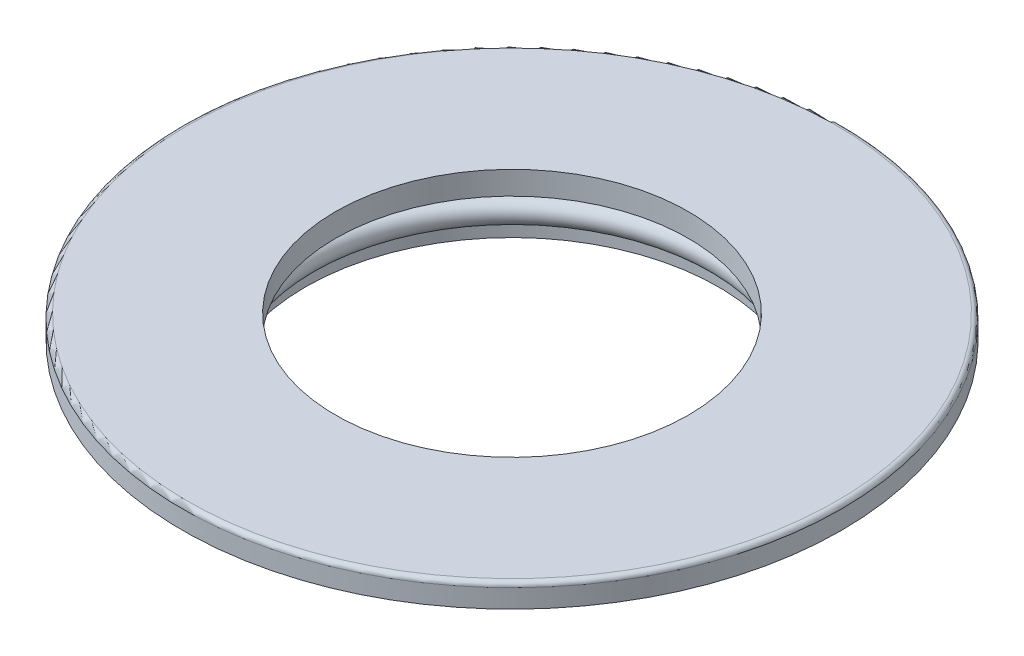
ISO-10303-21;
HEADER;
FILE_DESCRIPTION(('STEP AP214'),'2;1');
FILE_NAME('part.step','',(''),(''),'','','');
FILE_SCHEMA(('AUTOMOTIVE_DESIGN { 1 0 10303 214 1 1 1 1 }'));
ENDSEC;
DATA;
#1=APPLICATION_CONTEXT('core data for automotive mechanical design processes');
#2=APPLICATION_PROTOCOL_DEFINITION('international standard','automotive_design',2000,#1);
#3=PRODUCT_CONTEXT('',#1,'mechanical');
#4=PRODUCT('Part','Part','',(#3));
#5=PRODUCT_RELATED_PRODUCT_CATEGORY('part','',(#4));
#6=PRODUCT_DEFINITION_FORMATION('','',#4);
#7=PRODUCT_DEFINITION_CONTEXT('part definition',#1,'design');
#8=PRODUCT_DEFINITION('design','',#6,#7);
#9=PRODUCT_DEFINITION_SHAPE('','',#8);
#10=(LENGTH_UNIT() NAMED_UNIT(*) SI_UNIT(.MILLI.,.METRE.));
#11=(NAMED_UNIT(*) PLANE_ANGLE_UNIT() SI_UNIT($,.RADIAN.));
#12=(NAMED_UNIT(*) SI_UNIT($,.STERADIAN.) SOLID_ANGLE_UNIT());
#13=UNCERTAINTY_MEASURE_WITH_UNIT(LENGTH_MEASURE(1.E-05),#10,'distance_accuracy_value','');
#14=(GEOMETRIC_REPRESENTATION_CONTEXT(3) GLOBAL_UNCERTAINTY_ASSIGNED_CONTEXT((#13)) GLOBAL_UNIT_ASSIGNED_CONTEXT((#10,
#11,#12)) REPRESENTATION_CONTEXT('',''));
#15=CARTESIAN_POINT('',(0.,0.,0.));
#16=DIRECTION('',(0.,0.,1.));
#17=DIRECTION('',(1.,0.,0.));
#18=AXIS2_PLACEMENT_3D('',#15,#16,#17);
#19=CARTESIAN_POINT('',(97.4283139901652,39.892585804236,0.));
#20=DIRECTION('',(0.,1.,0.));
#21=DIRECTION('',(-1.,0.,0.));
#22=AXIS2_PLACEMENT_3D('',#19,#20,#21);
#23=CYLINDRICAL_SURFACE('',#22,38.);
#24=CARTESIAN_POINT('',(97.4283139901652,17.3301270189222,0.));
#25=DIRECTION('',(0.,1.,0.));
#26=DIRECTION('',(-1.,0.,0.));
#27=AXIS2_PLACEMENT_3D('',#24,#25,#26);
#28=CIRCLE('',#27,38.);
#29=CARTESIAN_POINT('',(59.4283139901652,17.3301270189222,0.));
#30=VERTEX_POINT('',#29);
#31=EDGE_CURVE('E74',#30,#30,#28,.T.);
#32=ORIENTED_EDGE('',*,*,#31,.T.);
#33=EDGE_LOOP('',(#32));
#34=FACE_BOUND('',#33,.T.);
#35=CARTESIAN_POINT('',(97.4283139901652,12.3301270189222,0.));
#36=DIRECTION('',(0.,1.,0.));
#37=DIRECTION('',(-1.,0.,0.));
#38=AXIS2_PLACEMENT_3D('',#35,#36,#37);
#39=CIRCLE('',#38,38.);
#40=CARTESIAN_POINT('',(59.4283139901652,12.3301270189222,0.));
#41=VERTEX_POINT('',#40);
#42=EDGE_CURVE('E10',#41,#41,#39,.T.);
#43=ORIENTED_EDGE('',*,*,#42,.F.);
#44=EDGE_LOOP('',(#43));
#45=FACE_BOUND('',#44,.T.);
#46=ADVANCED_FACE('F31',(#34,#45),#23,.F.);
#47=CARTESIAN_POINT('',(59.4283139901652,12.3301270189222,0.));
#48=DIRECTION('',(0.,-1.,0.));
#49=DIRECTION('',(1.,0.,0.));
#50=AXIS2_PLACEMENT_3D('',#47,#48,#49);
#51=PLANE('',#50);
#52=ORIENTED_EDGE('',*,*,#42,.T.);
#53=EDGE_LOOP('',(#52));
#54=FACE_BOUND('',#53,.T.);
#55=CARTESIAN_POINT('',(97.4283139901652,12.3301270189222,0.));
#56=DIRECTION('',(0.,1.,0.));
#57=DIRECTION('',(-1.,0.,0.));
#58=AXIS2_PLACEMENT_3D('',#55,#56,#57);
#59=CIRCLE('',#58,42.);
#60=CARTESIAN_POINT('',(55.4283139901652,12.3301270189222,0.));
#61=VERTEX_POINT('',#60);
#62=EDGE_CURVE('E37',#61,#61,#59,.T.);
#63=ORIENTED_EDGE('',*,*,#62,.F.);
#64=EDGE_LOOP('',(#63));
#65=FACE_BOUND('',#64,.T.);
#66=ADVANCED_FACE('F92',(#54,#65),#51,.T.);
#67=CARTESIAN_POINT('',(97.4283139901652,9.83012701892221,0.));
#68=DIRECTION('',(0.,1.,0.));
#69=DIRECTION('',(-1.,0.,0.));
#70=AXIS2_PLACEMENT_3D('',#67,#68,#69);
#71=TOROIDAL_SURFACE('',#70,42.,2.49999999999996);
#72=ORIENTED_EDGE('',*,*,#62,.T.);
#73=EDGE_LOOP('',(#72));
#74=FACE_BOUND('',#73,.T.);
#75=CARTESIAN_POINT('',(97.4283139901652,9.83012701892223,0.));
#76=DIRECTION('',(0.,1.,0.));
#77=DIRECTION('',(-1.,0.,0.));
#78=AXIS2_PLACEMENT_3D('',#75,#76,#77);
#79=CIRCLE('',#78,44.4999999999999);
#80=CARTESIAN_POINT('',(52.9283139901653,9.83012701892222,0.));
#81=VERTEX_POINT('',#80);
#82=EDGE_CURVE('E41',#81,#81,#79,.T.);
#83=ORIENTED_EDGE('',*,*,#82,.F.);
#84=EDGE_LOOP('',(#83));
#85=FACE_BOUND('',#84,.T.);
#86=ADVANCED_FACE('F96',(#74,#85),#71,.F.);
#87=CARTESIAN_POINT('',(97.4283139901652,39.892585804236,0.));
#88=DIRECTION('',(0.,1.,0.));
#89=DIRECTION('',(-1.,0.,0.));
#90=AXIS2_PLACEMENT_3D('',#87,#88,#89);
#91=CYLINDRICAL_SURFACE('',#90,44.4999999999999);
#92=ORIENTED_EDGE('',*,*,#82,.T.);
#93=EDGE_LOOP('',(#92));
#94=FACE_BOUND('',#93,.T.);
#95=CARTESIAN_POINT('',(97.4283139901652,8.00000000000004,0.));
#96=DIRECTION('',(0.,1.,0.));
#97=DIRECTION('',(-1.,0.,0.));
#98=AXIS2_PLACEMENT_3D('',#95,#96,#97);
#99=CIRCLE('',#98,44.4999999999999);
#100=CARTESIAN_POINT('',(52.9283139901653,8.00000000000002,0.));
#101=VERTEX_POINT('',#100);
#102=EDGE_CURVE('E45',#101,#101,#99,.T.);
#103=ORIENTED_EDGE('',*,*,#102,.F.);
#104=EDGE_LOOP('',(#103));
#105=FACE_BOUND('',#104,.T.);
#106=ADVANCED_FACE('F100',(#94,#105),#91,.F.);
#107=CARTESIAN_POINT('',(97.4283139901652,5.50000000000002,0.));
#108=DIRECTION('',(0.,1.,0.));
#109=DIRECTION('',(-1.,0.,0.));
#110=AXIS2_PLACEMENT_3D('',#107,#108,#109);
#111=TOROIDAL_SURFACE('',#110,44.5,2.50000000000002);
#112=ORIENTED_EDGE('',*,*,#102,.T.);
#113=EDGE_LOOP('',(#112));
#114=FACE_BOUND('',#113,.T.);
#115=CARTESIAN_POINT('',(97.4283139901652,3.,0.));
#116=DIRECTION('',(0.,1.,0.));
#117=DIRECTION('',(-1.,0.,0.));
#118=AXIS2_PLACEMENT_3D('',#115,#116,#117);
#119=CIRCLE('',#118,44.5);
#120=CARTESIAN_POINT('',(52.9283139901652,2.99999999999998,0.));
#121=VERTEX_POINT('',#120);
#122=EDGE_CURVE('E50',#121,#121,#119,.T.);
#123=ORIENTED_EDGE('',*,*,#122,.F.);
#124=EDGE_LOOP('',(#123));
#125=FACE_BOUND('',#124,.T.);
#126=ADVANCED_FACE('F106',(#114,#125),#111,.T.);
#127=CARTESIAN_POINT('',(97.4283139901652,39.892585804236,0.));
#128=DIRECTION('',(0.,1.,0.));
#129=DIRECTION('',(-1.,0.,0.));
#130=AXIS2_PLACEMENT_3D('',#127,#128,#129);
#131=CYLINDRICAL_SURFACE('',#130,44.5);
#132=ORIENTED_EDGE('',*,*,#122,.T.);
#133=EDGE_LOOP('',(#132));
#134=FACE_BOUND('',#133,.T.);
#135=CARTESIAN_POINT('',(97.4283139901652,0.,0.));
#136=DIRECTION('',(0.,1.,0.));
#137=DIRECTION('',(-1.,0.,0.));
#138=AXIS2_PLACEMENT_3D('',#135,#136,#137);
#139=CIRCLE('',#138,44.5);
#140=CARTESIAN_POINT('',(52.9283139901652,0.,0.));
#141=VERTEX_POINT('',#140);
#142=EDGE_CURVE('E53',#141,#141,#139,.T.);
#143=ORIENTED_EDGE('',*,*,#142,.F.);
#144=EDGE_LOOP('',(#143));
#145=FACE_BOUND('',#144,.T.);
#146=ADVANCED_FACE('F110',(#134,#145),#131,.F.);
#147=CARTESIAN_POINT('',(47.9283139901651,0.,0.));
#148=DIRECTION('',(0.,-1.,0.));
#149=DIRECTION('',(1.,0.,0.));
#150=AXIS2_PLACEMENT_3D('',#147,#148,#149);
#151=PLANE('',#150);
#152=ORIENTED_EDGE('',*,*,#142,.T.);
#153=EDGE_LOOP('',(#152));
#154=FACE_BOUND('',#153,.T.);
#155=CARTESIAN_POINT('',(97.4283139901652,0.,0.));
#156=DIRECTION('',(0.,1.,0.));
#157=DIRECTION('',(-1.,0.,0.));
#158=AXIS2_PLACEMENT_3D('',#155,#156,#157);
#159=CIRCLE('',#158,49.5000000000001);
#160=CARTESIAN_POINT('',(47.9283139901651,0.,0.));
#161=VERTEX_POINT('',#160);
#162=EDGE_CURVE('E56',#161,#161,#159,.T.);
#163=ORIENTED_EDGE('',*,*,#162,.F.);
#164=EDGE_LOOP('',(#163));
#165=FACE_BOUND('',#164,.T.);
#166=ADVANCED_FACE('F114',(#154,#165),#151,.T.);
#167=CARTESIAN_POINT('',(97.4283139901652,39.892585804236,0.));
#168=DIRECTION('',(0.,1.,0.));
#169=DIRECTION('',(-1.,0.,0.));
#170=AXIS2_PLACEMENT_3D('',#167,#168,#169);
#171=CYLINDRICAL_SURFACE('',#170,49.5000000000001);
#172=ORIENTED_EDGE('',*,*,#162,.T.);
#173=EDGE_LOOP('',(#172));
#174=FACE_BOUND('',#173,.T.);
#175=CARTESIAN_POINT('',(97.4283139901652,7.33012701892219,0.));
#176=DIRECTION('',(0.,1.,0.));
#177=DIRECTION('',(-1.,0.,0.));
#178=AXIS2_PLACEMENT_3D('',#175,#176,#177);
#179=CIRCLE('',#178,49.5000000000001);
#180=CARTESIAN_POINT('',(47.9283139901651,7.33012701892218,0.));
#181=VERTEX_POINT('',#180);
#182=EDGE_CURVE('E59',#181,#181,#179,.T.);
#183=ORIENTED_EDGE('',*,*,#182,.F.);
#184=EDGE_LOOP('',(#183));
#185=FACE_BOUND('',#184,.T.);
#186=ADVANCED_FACE('F118',(#174,#185),#171,.T.);
#187=CARTESIAN_POINT('',(97.4283139901652,7.33012701892222,0.));
#188=DIRECTION('',(0.,1.,0.));
#189=DIRECTION('',(-1.,0.,0.));
#190=AXIS2_PLACEMENT_3D('',#187,#188,#189);
#191=TOROIDAL_SURFACE('',#190,54.5000000000001,5.);
#192=ORIENTED_EDGE('',*,*,#182,.T.);
#193=EDGE_LOOP('',(#192));
#194=FACE_BOUND('',#193,.T.);
#195=CARTESIAN_POINT('',(97.4283139901652,12.3301270189222,0.));
#196=DIRECTION('',(0.,1.,0.));
#197=DIRECTION('',(-1.,0.,0.));
#198=AXIS2_PLACEMENT_3D('',#195,#196,#197);
#199=CIRCLE('',#198,54.5000000000001);
#200=CARTESIAN_POINT('',(42.9283139901651,12.3301270189222,0.));
#201=VERTEX_POINT('',#200);
#202=EDGE_CURVE('E62',#201,#201,#199,.T.);
#203=ORIENTED_EDGE('',*,*,#202,.F.);
#204=EDGE_LOOP('',(#203));
#205=FACE_BOUND('',#204,.T.);
#206=ADVANCED_FACE('F122',(#194,#205),#191,.F.);
#207=CARTESIAN_POINT('',(42.9283139901651,12.3301270189222,0.));
#208=DIRECTION('',(0.,-1.,0.));
#209=DIRECTION('',(1.,0.,0.));
#210=AXIS2_PLACEMENT_3D('',#207,#208,#209);
#211=PLANE('',#210);
#212=ORIENTED_EDGE('',*,*,#202,.T.);
#213=EDGE_LOOP('',(#212));
#214=FACE_BOUND('',#213,.T.);
#215=CARTESIAN_POINT('',(97.4283139901652,12.3301270189222,0.));
#216=DIRECTION('',(0.,1.,0.));
#217=DIRECTION('',(-1.,0.,0.));
#218=AXIS2_PLACEMENT_3D('',#215,#216,#217);
#219=CIRCLE('',#218,71.);
#220=CARTESIAN_POINT('',(26.4283139901652,12.3301270189222,0.));
#221=VERTEX_POINT('',#220);
#222=EDGE_CURVE('E65',#221,#221,#219,.T.);
#223=ORIENTED_EDGE('',*,*,#222,.F.);
#224=EDGE_LOOP('',(#223));
#225=FACE_BOUND('',#224,.T.);
#226=ADVANCED_FACE('F126',(#214,#225),#211,.T.);
#227=CARTESIAN_POINT('',(97.4283139901652,39.892585804236,0.));
#228=DIRECTION('',(0.,1.,0.));
#229=DIRECTION('',(-1.,0.,0.));
#230=AXIS2_PLACEMENT_3D('',#227,#228,#229);
#231=CYLINDRICAL_SURFACE('',#230,71.);
#232=ORIENTED_EDGE('',*,*,#222,.T.);
#233=EDGE_LOOP('',(#232));
#234=FACE_BOUND('',#233,.T.);
#235=CARTESIAN_POINT('',(97.4283139901652,16.3301270189222,0.));
#236=DIRECTION('',(0.,1.,0.));
#237=DIRECTION('',(-1.,0.,0.));
#238=AXIS2_PLACEMENT_3D('',#235,#236,#237);
#239=CIRCLE('',#238,71.);
#240=CARTESIAN_POINT('',(26.4283139901652,16.3301270189222,0.));
#241=VERTEX_POINT('',#240);
#242=EDGE_CURVE('E68',#241,#241,#239,.T.);
#243=ORIENTED_EDGE('',*,*,#242,.F.);
#244=EDGE_LOOP('',(#243));
#245=FACE_BOUND('',#244,.T.);
#246=ADVANCED_FACE('F88',(#234,#245),#231,.T.);
#247=CARTESIAN_POINT('',(97.4283139901652,16.3301270189222,0.));
#248=DIRECTION('',(0.,1.,0.));
#249=DIRECTION('',(-1.,0.,0.));
#250=AXIS2_PLACEMENT_3D('',#247,#248,#249);
#251=TOROIDAL_SURFACE('',#250,70.,1.);
#252=ORIENTED_EDGE('',*,*,#242,.T.);
#253=EDGE_LOOP('',(#252));
#254=FACE_BOUND('',#253,.T.);
#255=CARTESIAN_POINT('',(97.4283139901652,17.3301270189222,0.));
#256=DIRECTION('',(0.,1.,0.));
#257=DIRECTION('',(-1.,0.,0.));
#258=AXIS2_PLACEMENT_3D('',#255,#256,#257);
#259=CIRCLE('',#258,70.);
#260=CARTESIAN_POINT('',(27.4283139901652,17.3301270189222,0.));
#261=VERTEX_POINT('',#260);
#262=EDGE_CURVE('E71',#261,#261,#259,.T.);
#263=ORIENTED_EDGE('',*,*,#262,.F.);
#264=EDGE_LOOP('',(#263));
#265=FACE_BOUND('',#264,.T.);
#266=ADVANCED_FACE('F82',(#254,#265),#251,.T.);
#267=CARTESIAN_POINT('',(27.4283139901652,17.3301270189222,0.));
#268=DIRECTION('',(0.,1.,0.));
#269=DIRECTION('',(-1.,0.,0.));
#270=AXIS2_PLACEMENT_3D('',#267,#268,#269);
#271=PLANE('',#270);
#272=ORIENTED_EDGE('',*,*,#262,.T.);
#273=EDGE_LOOP('',(#272));
#274=FACE_BOUND('',#273,.T.);
#275=ORIENTED_EDGE('',*,*,#31,.F.);
#276=EDGE_LOOP('',(#275));
#277=FACE_BOUND('',#276,.T.);
#278=ADVANCED_FACE('F80',(#274,#277),#271,.T.);
#279=CLOSED_SHELL('',(#46,#66,#86,#106,#126,#146,#166,#186,#206,#226,#246,#266,#278));
#280=MANIFOLD_SOLID_BREP('B2',#279);
#281=ADVANCED_BREP_SHAPE_REPRESENTATION('',(#18,#280),#14);
#282=SHAPE_DEFINITION_REPRESENTATION(#9,#281);
ENDSEC;
END-ISO-10303-21;
